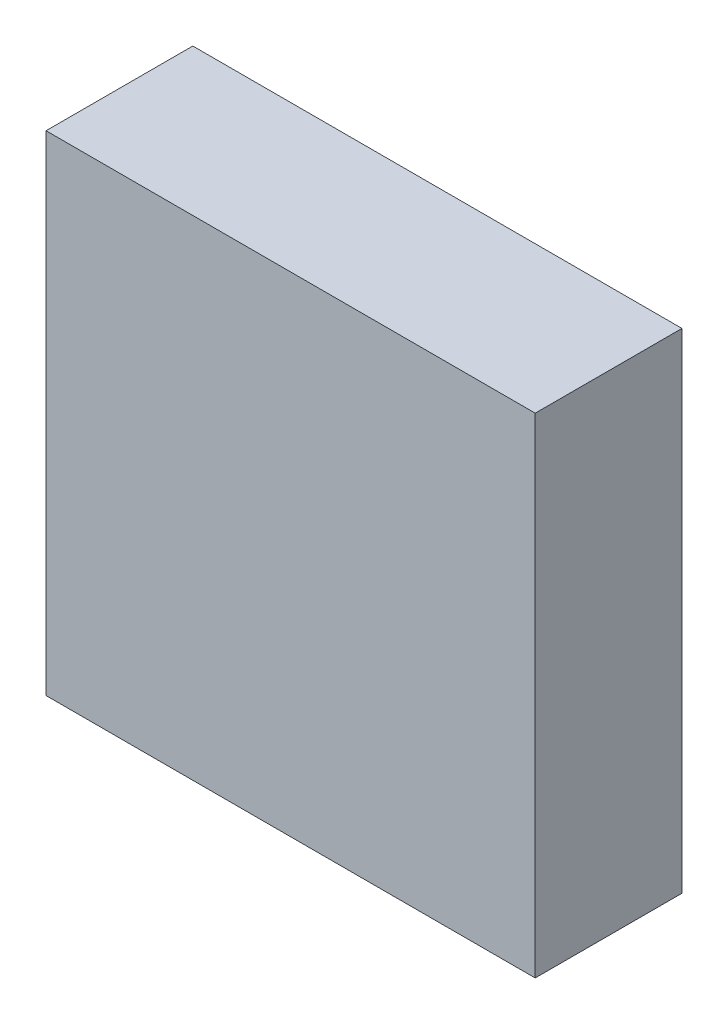
ISO-10303-21;
HEADER;
FILE_DESCRIPTION(('STEP AP214'),'2;1');
FILE_NAME('part.step','',(''),(''),'','','');
FILE_SCHEMA(('AUTOMOTIVE_DESIGN { 1 0 10303 214 1 1 1 1 }'));
ENDSEC;
DATA;
#1=APPLICATION_CONTEXT('core data for automotive mechanical design processes');
#2=APPLICATION_PROTOCOL_DEFINITION('international standard','automotive_design',2000,#1);
#3=PRODUCT_CONTEXT('',#1,'mechanical');
#4=PRODUCT('Part','Part','',(#3));
#5=PRODUCT_RELATED_PRODUCT_CATEGORY('part','',(#4));
#6=PRODUCT_DEFINITION_FORMATION('','',#4);
#7=PRODUCT_DEFINITION_CONTEXT('part definition',#1,'design');
#8=PRODUCT_DEFINITION('design','',#6,#7);
#9=PRODUCT_DEFINITION_SHAPE('','',#8);
#10=(LENGTH_UNIT() NAMED_UNIT(*) SI_UNIT(.MILLI.,.METRE.));
#11=(NAMED_UNIT(*) PLANE_ANGLE_UNIT() SI_UNIT($,.RADIAN.));
#12=(NAMED_UNIT(*) SI_UNIT($,.STERADIAN.) SOLID_ANGLE_UNIT());
#13=UNCERTAINTY_MEASURE_WITH_UNIT(LENGTH_MEASURE(1.E-05),#10,'distance_accuracy_value','');
#14=(GEOMETRIC_REPRESENTATION_CONTEXT(3) GLOBAL_UNCERTAINTY_ASSIGNED_CONTEXT((#13)) GLOBAL_UNIT_ASSIGNED_CONTEXT((#10,
#11,#12)) REPRESENTATION_CONTEXT('',''));
#15=CARTESIAN_POINT('',(0.,0.,0.));
#16=DIRECTION('',(0.,0.,1.));
#17=DIRECTION('',(1.,0.,0.));
#18=AXIS2_PLACEMENT_3D('',#15,#16,#17);
#19=CARTESIAN_POINT('',(50.,-50.,30.));
#20=DIRECTION('',(-1.,0.,0.));
#21=DIRECTION('',(0.,0.,1.));
#22=AXIS2_PLACEMENT_3D('',#19,#20,#21);
#23=PLANE('',#22);
#24=DIRECTION('',(0.,1.,0.));
#25=VECTOR('',#24,1.);
#26=CARTESIAN_POINT('',(50.,-50.,0.));
#27=LINE('',#26,#25);
#28=CARTESIAN_POINT('',(50.,-50.,0.));
#29=VERTEX_POINT('',#28);
#30=CARTESIAN_POINT('',(50.,50.,0.));
#31=VERTEX_POINT('',#30);
#32=EDGE_CURVE('E100',#29,#31,#27,.T.);
#33=ORIENTED_EDGE('',*,*,#32,.T.);
#34=DIRECTION('',(0.,0.,-1.));
#35=VECTOR('',#34,1.);
#36=CARTESIAN_POINT('',(50.,50.,30.));
#37=LINE('',#36,#35);
#38=CARTESIAN_POINT('',(50.,50.,30.));
#39=VERTEX_POINT('',#38);
#40=EDGE_CURVE('E11',#39,#31,#37,.T.);
#41=ORIENTED_EDGE('',*,*,#40,.F.);
#42=DIRECTION('',(0.,1.,0.));
#43=VECTOR('',#42,1.);
#44=CARTESIAN_POINT('',(50.,-50.,30.));
#45=LINE('',#44,#43);
#46=CARTESIAN_POINT('',(50.,-50.,30.));
#47=VERTEX_POINT('',#46);
#48=EDGE_CURVE('E88',#47,#39,#45,.T.);
#49=ORIENTED_EDGE('',*,*,#48,.F.);
#50=DIRECTION('',(0.,0.,-1.));
#51=VECTOR('',#50,1.);
#52=CARTESIAN_POINT('',(50.,-50.,30.));
#53=LINE('',#52,#51);
#54=EDGE_CURVE('E96',#47,#29,#53,.T.);
#55=ORIENTED_EDGE('',*,*,#54,.T.);
#56=EDGE_LOOP('',(#33,#41,#49,#55));
#57=FACE_BOUND('',#56,.T.);
#58=ADVANCED_FACE('F37',(#57),#23,.F.);
#59=CARTESIAN_POINT('',(-50.,50.,30.));
#60=DIRECTION('',(0.,-1.,0.));
#61=DIRECTION('',(0.,0.,-1.));
#62=AXIS2_PLACEMENT_3D('',#59,#60,#61);
#63=PLANE('',#62);
#64=DIRECTION('',(-1.,0.,0.));
#65=VECTOR('',#64,1.);
#66=CARTESIAN_POINT('',(-50.,50.,0.));
#67=LINE('',#66,#65);
#68=CARTESIAN_POINT('',(-50.,50.,0.));
#69=VERTEX_POINT('',#68);
#70=EDGE_CURVE('E92',#31,#69,#67,.T.);
#71=ORIENTED_EDGE('',*,*,#70,.T.);
#72=DIRECTION('',(0.,0.,-1.));
#73=VECTOR('',#72,1.);
#74=CARTESIAN_POINT('',(-50.,50.,30.));
#75=LINE('',#74,#73);
#76=CARTESIAN_POINT('',(-50.,50.,30.));
#77=VERTEX_POINT('',#76);
#78=EDGE_CURVE('E45',#77,#69,#75,.T.);
#79=ORIENTED_EDGE('',*,*,#78,.F.);
#80=DIRECTION('',(-1.,0.,0.));
#81=VECTOR('',#80,1.);
#82=CARTESIAN_POINT('',(-50.,50.,30.));
#83=LINE('',#82,#81);
#84=EDGE_CURVE('E83',#39,#77,#83,.T.);
#85=ORIENTED_EDGE('',*,*,#84,.F.);
#86=ORIENTED_EDGE('',*,*,#40,.T.);
#87=EDGE_LOOP('',(#71,#79,#85,#86));
#88=FACE_BOUND('',#87,.T.);
#89=ADVANCED_FACE('F91',(#88),#63,.F.);
#90=CARTESIAN_POINT('',(-50.,-50.,30.));
#91=DIRECTION('',(1.,0.,0.));
#92=DIRECTION('',(0.,0.,-1.));
#93=AXIS2_PLACEMENT_3D('',#90,#91,#92);
#94=PLANE('',#93);
#95=DIRECTION('',(0.,-1.,0.));
#96=VECTOR('',#95,1.);
#97=CARTESIAN_POINT('',(-50.,-50.,0.));
#98=LINE('',#97,#96);
#99=CARTESIAN_POINT('',(-50.,-50.,0.));
#100=VERTEX_POINT('',#99);
#101=EDGE_CURVE('E70',#69,#100,#98,.T.);
#102=ORIENTED_EDGE('',*,*,#101,.T.);
#103=DIRECTION('',(0.,0.,-1.));
#104=VECTOR('',#103,1.);
#105=CARTESIAN_POINT('',(-50.,-50.,30.));
#106=LINE('',#105,#104);
#107=CARTESIAN_POINT('',(-50.,-50.,30.));
#108=VERTEX_POINT('',#107);
#109=EDGE_CURVE('E93',#108,#100,#106,.T.);
#110=ORIENTED_EDGE('',*,*,#109,.F.);
#111=DIRECTION('',(0.,-1.,0.));
#112=VECTOR('',#111,1.);
#113=CARTESIAN_POINT('',(-50.,-50.,30.));
#114=LINE('',#113,#112);
#115=EDGE_CURVE('E86',#77,#108,#114,.T.);
#116=ORIENTED_EDGE('',*,*,#115,.F.);
#117=ORIENTED_EDGE('',*,*,#78,.T.);
#118=EDGE_LOOP('',(#102,#110,#116,#117));
#119=FACE_BOUND('',#118,.T.);
#120=ADVANCED_FACE('F94',(#119),#94,.F.);
#121=CARTESIAN_POINT('',(-50.,-50.,30.));
#122=DIRECTION('',(0.,1.,0.));
#123=DIRECTION('',(0.,0.,1.));
#124=AXIS2_PLACEMENT_3D('',#121,#122,#123);
#125=PLANE('',#124);
#126=DIRECTION('',(1.,0.,0.));
#127=VECTOR('',#126,1.);
#128=CARTESIAN_POINT('',(-50.,-50.,0.));
#129=LINE('',#128,#127);
#130=EDGE_CURVE('E76',#100,#29,#129,.T.);
#131=ORIENTED_EDGE('',*,*,#130,.T.);
#132=ORIENTED_EDGE('',*,*,#54,.F.);
#133=DIRECTION('',(1.,0.,0.));
#134=VECTOR('',#133,1.);
#135=CARTESIAN_POINT('',(-50.,-50.,30.));
#136=LINE('',#135,#134);
#137=EDGE_CURVE('E53',#108,#47,#136,.T.);
#138=ORIENTED_EDGE('',*,*,#137,.F.);
#139=ORIENTED_EDGE('',*,*,#109,.T.);
#140=EDGE_LOOP('',(#131,#132,#138,#139));
#141=FACE_BOUND('',#140,.T.);
#142=ADVANCED_FACE('F107',(#141),#125,.F.);
#143=CARTESIAN_POINT('',(0.,0.,30.));
#144=DIRECTION('',(0.,0.,-1.));
#145=DIRECTION('',(-1.,0.,0.));
#146=AXIS2_PLACEMENT_3D('',#143,#144,#145);
#147=PLANE('',#146);
#148=ORIENTED_EDGE('',*,*,#48,.T.);
#149=ORIENTED_EDGE('',*,*,#84,.T.);
#150=ORIENTED_EDGE('',*,*,#115,.T.);
#151=ORIENTED_EDGE('',*,*,#137,.T.);
#152=EDGE_LOOP('',(#148,#149,#150,#151));
#153=FACE_BOUND('',#152,.T.);
#154=ADVANCED_FACE('F84',(#153),#147,.F.);
#155=CARTESIAN_POINT('',(0.,0.,0.));
#156=DIRECTION('',(0.,0.,-1.));
#157=DIRECTION('',(-1.,0.,0.));
#158=AXIS2_PLACEMENT_3D('',#155,#156,#157);
#159=PLANE('',#158);
#160=ORIENTED_EDGE('',*,*,#32,.F.);
#161=ORIENTED_EDGE('',*,*,#130,.F.);
#162=ORIENTED_EDGE('',*,*,#101,.F.);
#163=ORIENTED_EDGE('',*,*,#70,.F.);
#164=EDGE_LOOP('',(#160,#161,#162,#163));
#165=FACE_BOUND('',#164,.T.);
#166=ADVANCED_FACE('F110',(#165),#159,.T.);
#167=CLOSED_SHELL('',(#58,#89,#120,#142,#154,#166));
#168=MANIFOLD_SOLID_BREP('B2',#167);
#169=ADVANCED_BREP_SHAPE_REPRESENTATION('',(#18,#168),#14);
#170=SHAPE_DEFINITION_REPRESENTATION(#9,#169);
ENDSEC;
END-ISO-10303-21;
